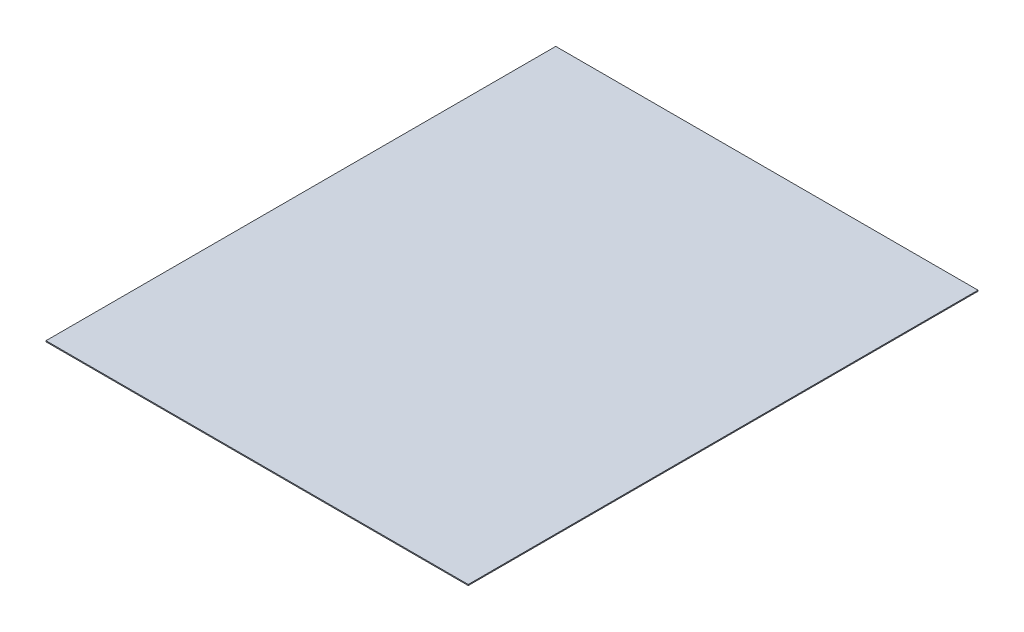
ISO-10303-21;
HEADER;
FILE_DESCRIPTION(('STEP AP214'),'2;1');
FILE_NAME('part.step','',(''),(''),'','','');
FILE_SCHEMA(('AUTOMOTIVE_DESIGN { 1 0 10303 214 1 1 1 1 }'));
ENDSEC;
DATA;
#1=APPLICATION_CONTEXT('core data for automotive mechanical design processes');
#2=APPLICATION_PROTOCOL_DEFINITION('international standard','automotive_design',2000,#1);
#3=PRODUCT_CONTEXT('',#1,'mechanical');
#4=PRODUCT('Part','Part','',(#3));
#5=PRODUCT_RELATED_PRODUCT_CATEGORY('part','',(#4));
#6=PRODUCT_DEFINITION_FORMATION('','',#4);
#7=PRODUCT_DEFINITION_CONTEXT('part definition',#1,'design');
#8=PRODUCT_DEFINITION('design','',#6,#7);
#9=PRODUCT_DEFINITION_SHAPE('','',#8);
#10=(LENGTH_UNIT() NAMED_UNIT(*) SI_UNIT(.MILLI.,.METRE.));
#11=(NAMED_UNIT(*) PLANE_ANGLE_UNIT() SI_UNIT($,.RADIAN.));
#12=(NAMED_UNIT(*) SI_UNIT($,.STERADIAN.) SOLID_ANGLE_UNIT());
#13=UNCERTAINTY_MEASURE_WITH_UNIT(LENGTH_MEASURE(1.E-05),#10,'distance_accuracy_value','');
#14=(GEOMETRIC_REPRESENTATION_CONTEXT(3) GLOBAL_UNCERTAINTY_ASSIGNED_CONTEXT((#13)) GLOBAL_UNIT_ASSIGNED_CONTEXT((#10,
#11,#12)) REPRESENTATION_CONTEXT('',''));
#15=CARTESIAN_POINT('',(0.,0.,0.));
#16=DIRECTION('',(0.,0.,1.));
#17=DIRECTION('',(1.,0.,0.));
#18=AXIS2_PLACEMENT_3D('',#15,#16,#17);
#19=CARTESIAN_POINT('',(62.5,403.,-757.5));
#20=DIRECTION('',(-1.,0.,0.));
#21=DIRECTION('',(0.,0.,1.));
#22=AXIS2_PLACEMENT_3D('',#19,#20,#21);
#23=PLANE('',#22);
#24=DIRECTION('',(0.,-1.,0.));
#25=VECTOR('',#24,1.);
#26=CARTESIAN_POINT('',(62.5,403.,0.));
#27=LINE('',#26,#25);
#28=CARTESIAN_POINT('',(62.5,404.5,0.));
#29=VERTEX_POINT('',#28);
#30=CARTESIAN_POINT('',(62.5,403.,0.));
#31=VERTEX_POINT('',#30);
#32=EDGE_CURVE('E103',#29,#31,#27,.T.);
#33=ORIENTED_EDGE('',*,*,#32,.F.);
#34=DIRECTION('',(0.,0.,1.));
#35=VECTOR('',#34,1.);
#36=CARTESIAN_POINT('',(62.5,404.5,-757.5));
#37=LINE('',#36,#35);
#38=CARTESIAN_POINT('',(62.5,404.5,-757.5));
#39=VERTEX_POINT('',#38);
#40=EDGE_CURVE('E11',#39,#29,#37,.T.);
#41=ORIENTED_EDGE('',*,*,#40,.F.);
#42=DIRECTION('',(0.,-1.,0.));
#43=VECTOR('',#42,1.);
#44=CARTESIAN_POINT('',(62.5,403.,-757.5));
#45=LINE('',#44,#43);
#46=CARTESIAN_POINT('',(62.5,403.,-757.5));
#47=VERTEX_POINT('',#46);
#48=EDGE_CURVE('E97',#39,#47,#45,.T.);
#49=ORIENTED_EDGE('',*,*,#48,.T.);
#50=DIRECTION('',(0.,0.,1.));
#51=VECTOR('',#50,1.);
#52=CARTESIAN_POINT('',(62.5,403.,-757.5));
#53=LINE('',#52,#51);
#54=EDGE_CURVE('E42',#47,#31,#53,.T.);
#55=ORIENTED_EDGE('',*,*,#54,.T.);
#56=EDGE_LOOP('',(#33,#41,#49,#55));
#57=FACE_BOUND('',#56,.T.);
#58=ADVANCED_FACE('F39',(#57),#23,.T.);
#59=CARTESIAN_POINT('',(62.5,404.5,-757.5));
#60=DIRECTION('',(0.,1.,0.));
#61=DIRECTION('',(0.,0.,1.));
#62=AXIS2_PLACEMENT_3D('',#59,#60,#61);
#63=PLANE('',#62);
#64=DIRECTION('',(-1.,0.,0.));
#65=VECTOR('',#64,1.);
#66=CARTESIAN_POINT('',(62.5,404.5,0.));
#67=LINE('',#66,#65);
#68=CARTESIAN_POINT('',(690.,404.5,0.));
#69=VERTEX_POINT('',#68);
#70=EDGE_CURVE('E99',#69,#29,#67,.T.);
#71=ORIENTED_EDGE('',*,*,#70,.F.);
#72=DIRECTION('',(0.,0.,1.));
#73=VECTOR('',#72,1.);
#74=CARTESIAN_POINT('',(690.,404.5,-757.5));
#75=LINE('',#74,#73);
#76=CARTESIAN_POINT('',(690.,404.5,-757.5));
#77=VERTEX_POINT('',#76);
#78=EDGE_CURVE('E48',#77,#69,#75,.T.);
#79=ORIENTED_EDGE('',*,*,#78,.F.);
#80=DIRECTION('',(-1.,0.,0.));
#81=VECTOR('',#80,1.);
#82=CARTESIAN_POINT('',(62.5,404.5,-757.5));
#83=LINE('',#82,#81);
#84=EDGE_CURVE('E94',#77,#39,#83,.T.);
#85=ORIENTED_EDGE('',*,*,#84,.T.);
#86=ORIENTED_EDGE('',*,*,#40,.T.);
#87=EDGE_LOOP('',(#71,#79,#85,#86));
#88=FACE_BOUND('',#87,.T.);
#89=ADVANCED_FACE('F113',(#88),#63,.T.);
#90=CARTESIAN_POINT('',(690.,403.,-757.5));
#91=DIRECTION('',(1.,0.,0.));
#92=DIRECTION('',(0.,0.,-1.));
#93=AXIS2_PLACEMENT_3D('',#90,#91,#92);
#94=PLANE('',#93);
#95=DIRECTION('',(0.,1.,0.));
#96=VECTOR('',#95,1.);
#97=CARTESIAN_POINT('',(690.,403.,0.));
#98=LINE('',#97,#96);
#99=CARTESIAN_POINT('',(690.,403.,0.));
#100=VERTEX_POINT('',#99);
#101=EDGE_CURVE('E89',#100,#69,#98,.T.);
#102=ORIENTED_EDGE('',*,*,#101,.F.);
#103=DIRECTION('',(0.,0.,1.));
#104=VECTOR('',#103,1.);
#105=CARTESIAN_POINT('',(690.,403.,-757.5));
#106=LINE('',#105,#104);
#107=CARTESIAN_POINT('',(690.,403.,-757.5));
#108=VERTEX_POINT('',#107);
#109=EDGE_CURVE('E84',#108,#100,#106,.T.);
#110=ORIENTED_EDGE('',*,*,#109,.F.);
#111=DIRECTION('',(0.,1.,0.));
#112=VECTOR('',#111,1.);
#113=CARTESIAN_POINT('',(690.,403.,-757.5));
#114=LINE('',#113,#112);
#115=EDGE_CURVE('E87',#108,#77,#114,.T.);
#116=ORIENTED_EDGE('',*,*,#115,.T.);
#117=ORIENTED_EDGE('',*,*,#78,.T.);
#118=EDGE_LOOP('',(#102,#110,#116,#117));
#119=FACE_BOUND('',#118,.T.);
#120=ADVANCED_FACE('F86',(#119),#94,.T.);
#121=CARTESIAN_POINT('',(62.5,403.,-757.5));
#122=DIRECTION('',(0.,-1.,0.));
#123=DIRECTION('',(0.,0.,-1.));
#124=AXIS2_PLACEMENT_3D('',#121,#122,#123);
#125=PLANE('',#124);
#126=DIRECTION('',(1.,0.,0.));
#127=VECTOR('',#126,1.);
#128=CARTESIAN_POINT('',(62.5,403.,0.));
#129=LINE('',#128,#127);
#130=EDGE_CURVE('E106',#31,#100,#129,.T.);
#131=ORIENTED_EDGE('',*,*,#130,.F.);
#132=ORIENTED_EDGE('',*,*,#54,.F.);
#133=DIRECTION('',(1.,0.,0.));
#134=VECTOR('',#133,1.);
#135=CARTESIAN_POINT('',(62.5,403.,-757.5));
#136=LINE('',#135,#134);
#137=EDGE_CURVE('E93',#47,#108,#136,.T.);
#138=ORIENTED_EDGE('',*,*,#137,.T.);
#139=ORIENTED_EDGE('',*,*,#109,.T.);
#140=EDGE_LOOP('',(#131,#132,#138,#139));
#141=FACE_BOUND('',#140,.T.);
#142=ADVANCED_FACE('F96',(#141),#125,.T.);
#143=CARTESIAN_POINT('',(0.,0.,-757.5));
#144=DIRECTION('',(0.,0.,-1.));
#145=DIRECTION('',(-1.,0.,0.));
#146=AXIS2_PLACEMENT_3D('',#143,#144,#145);
#147=PLANE('',#146);
#148=ORIENTED_EDGE('',*,*,#48,.F.);
#149=ORIENTED_EDGE('',*,*,#84,.F.);
#150=ORIENTED_EDGE('',*,*,#115,.F.);
#151=ORIENTED_EDGE('',*,*,#137,.F.);
#152=EDGE_LOOP('',(#148,#149,#150,#151));
#153=FACE_BOUND('',#152,.T.);
#154=ADVANCED_FACE('F92',(#153),#147,.T.);
#155=CARTESIAN_POINT('',(0.,0.,0.));
#156=DIRECTION('',(0.,0.,-1.));
#157=DIRECTION('',(-1.,0.,0.));
#158=AXIS2_PLACEMENT_3D('',#155,#156,#157);
#159=PLANE('',#158);
#160=ORIENTED_EDGE('',*,*,#32,.T.);
#161=ORIENTED_EDGE('',*,*,#130,.T.);
#162=ORIENTED_EDGE('',*,*,#101,.T.);
#163=ORIENTED_EDGE('',*,*,#70,.T.);
#164=EDGE_LOOP('',(#160,#161,#162,#163));
#165=FACE_BOUND('',#164,.T.);
#166=ADVANCED_FACE('F112',(#165),#159,.F.);
#167=CLOSED_SHELL('',(#58,#89,#120,#142,#154,#166));
#168=MANIFOLD_SOLID_BREP('B2',#167);
#169=ADVANCED_BREP_SHAPE_REPRESENTATION('',(#18,#168),#14);
#170=SHAPE_DEFINITION_REPRESENTATION(#9,#169);
ENDSEC;
END-ISO-10303-21;
